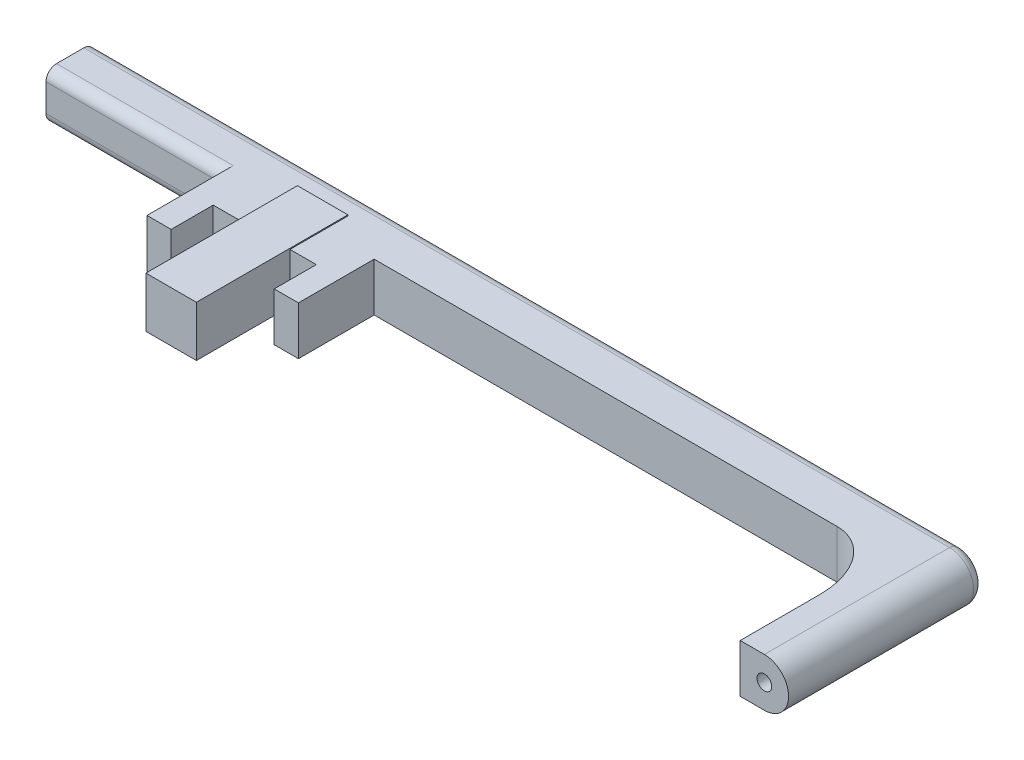
ISO-10303-21;
HEADER;
FILE_DESCRIPTION(('STEP AP214'),'2;1');
FILE_NAME('part.step','',(''),(''),'','','');
FILE_SCHEMA(('AUTOMOTIVE_DESIGN { 1 0 10303 214 1 1 1 1 }'));
ENDSEC;
DATA;
#1=APPLICATION_CONTEXT('core data for automotive mechanical design processes');
#2=APPLICATION_PROTOCOL_DEFINITION('international standard','automotive_design',2000,#1);
#3=PRODUCT_CONTEXT('',#1,'mechanical');
#4=PRODUCT('Part','Part','',(#3));
#5=PRODUCT_RELATED_PRODUCT_CATEGORY('part','',(#4));
#6=PRODUCT_DEFINITION_FORMATION('','',#4);
#7=PRODUCT_DEFINITION_CONTEXT('part definition',#1,'design');
#8=PRODUCT_DEFINITION('design','',#6,#7);
#9=PRODUCT_DEFINITION_SHAPE('','',#8);
#10=(LENGTH_UNIT() NAMED_UNIT(*) SI_UNIT(.MILLI.,.METRE.));
#11=(NAMED_UNIT(*) PLANE_ANGLE_UNIT() SI_UNIT($,.RADIAN.));
#12=(NAMED_UNIT(*) SI_UNIT($,.STERADIAN.) SOLID_ANGLE_UNIT());
#13=UNCERTAINTY_MEASURE_WITH_UNIT(LENGTH_MEASURE(1.E-05),#10,'distance_accuracy_value','');
#14=(GEOMETRIC_REPRESENTATION_CONTEXT(3) GLOBAL_UNCERTAINTY_ASSIGNED_CONTEXT((#13)) GLOBAL_UNIT_ASSIGNED_CONTEXT((#10,
#11,#12)) REPRESENTATION_CONTEXT('',''));
#15=CARTESIAN_POINT('',(0.,0.,0.));
#16=DIRECTION('',(0.,0.,1.));
#17=DIRECTION('',(1.,0.,0.));
#18=AXIS2_PLACEMENT_3D('',#15,#16,#17);
#19=CARTESIAN_POINT('',(1.2,-1.2,7.2));
#20=DIRECTION('',(-1.,0.,0.));
#21=DIRECTION('',(0.,0.,1.));
#22=AXIS2_PLACEMENT_3D('',#19,#20,#21);
#23=PLANE('',#22);
#24=DIRECTION('',(0.,-1.,0.));
#25=VECTOR('',#24,1.);
#26=CARTESIAN_POINT('',(1.2,-1.2,2.75));
#27=LINE('',#26,#25);
#28=CARTESIAN_POINT('',(1.2,1.15,2.75));
#29=VERTEX_POINT('',#28);
#30=CARTESIAN_POINT('',(1.2,-1.15,2.75));
#31=VERTEX_POINT('',#30);
#32=EDGE_CURVE('E526',#29,#31,#27,.T.);
#33=ORIENTED_EDGE('',*,*,#32,.F.);
#34=DIRECTION('',(0.,0.,-1.));
#35=VECTOR('',#34,1.);
#36=CARTESIAN_POINT('',(1.2,1.15,7.2));
#37=LINE('',#36,#35);
#38=CARTESIAN_POINT('',(1.2,1.15,0.));
#39=VERTEX_POINT('',#38);
#40=EDGE_CURVE('E248',#29,#39,#37,.T.);
#41=ORIENTED_EDGE('',*,*,#40,.T.);
#42=DIRECTION('',(0.,1.,0.));
#43=VECTOR('',#42,1.);
#44=CARTESIAN_POINT('',(1.2,-1.2,0.));
#45=LINE('',#44,#43);
#46=CARTESIAN_POINT('',(1.2,1.2,0.));
#47=VERTEX_POINT('',#46);
#48=EDGE_CURVE('E501',#39,#47,#45,.T.);
#49=ORIENTED_EDGE('',*,*,#48,.T.);
#50=DIRECTION('',(0.,0.,-1.));
#51=VECTOR('',#50,1.);
#52=CARTESIAN_POINT('',(1.2,1.2,7.2));
#53=LINE('',#52,#51);
#54=CARTESIAN_POINT('',(1.2,1.2,7.2));
#55=VERTEX_POINT('',#54);
#56=EDGE_CURVE('E476',#55,#47,#53,.T.);
#57=ORIENTED_EDGE('',*,*,#56,.F.);
#58=DIRECTION('',(0.,1.,0.));
#59=VECTOR('',#58,1.);
#60=CARTESIAN_POINT('',(1.2,-1.2,7.2));
#61=LINE('',#60,#59);
#62=CARTESIAN_POINT('',(1.2,-1.2,7.2));
#63=VERTEX_POINT('',#62);
#64=EDGE_CURVE('E492',#63,#55,#61,.T.);
#65=ORIENTED_EDGE('',*,*,#64,.F.);
#66=DIRECTION('',(0.,0.,-1.));
#67=VECTOR('',#66,1.);
#68=CARTESIAN_POINT('',(1.2,-1.2,7.2));
#69=LINE('',#68,#67);
#70=CARTESIAN_POINT('',(1.2,-1.2,0.));
#71=VERTEX_POINT('',#70);
#72=EDGE_CURVE('E486',#63,#71,#69,.T.);
#73=ORIENTED_EDGE('',*,*,#72,.T.);
#74=CARTESIAN_POINT('',(1.2,-1.15,0.));
#75=VERTEX_POINT('',#74);
#76=EDGE_CURVE('E498',#71,#75,#45,.T.);
#77=ORIENTED_EDGE('',*,*,#76,.T.);
#78=DIRECTION('',(0.,0.,1.));
#79=VECTOR('',#78,1.);
#80=CARTESIAN_POINT('',(1.2,-1.15,7.2));
#81=LINE('',#80,#79);
#82=EDGE_CURVE('E509',#75,#31,#81,.T.);
#83=ORIENTED_EDGE('',*,*,#82,.T.);
#84=EDGE_LOOP('',(#33,#41,#49,#57,#65,#73,#77,#83));
#85=FACE_BOUND('',#84,.T.);
#86=ADVANCED_FACE('F42',(#85),#23,.F.);
#87=CARTESIAN_POINT('',(-1.2,-1.2,7.2));
#88=DIRECTION('',(1.,0.,0.));
#89=DIRECTION('',(0.,0.,-1.));
#90=AXIS2_PLACEMENT_3D('',#87,#88,#89);
#91=PLANE('',#90);
#92=DIRECTION('',(0.,0.,1.));
#93=VECTOR('',#92,1.);
#94=CARTESIAN_POINT('',(-1.2,1.15,7.2));
#95=LINE('',#94,#93);
#96=CARTESIAN_POINT('',(-1.2,1.15,0.));
#97=VERTEX_POINT('',#96);
#98=CARTESIAN_POINT('',(-1.2,1.15,2.75));
#99=VERTEX_POINT('',#98);
#100=EDGE_CURVE('E60',#97,#99,#95,.T.);
#101=ORIENTED_EDGE('',*,*,#100,.T.);
#102=DIRECTION('',(0.,1.,0.));
#103=VECTOR('',#102,1.);
#104=CARTESIAN_POINT('',(-1.2,-1.2,2.75));
#105=LINE('',#104,#103);
#106=CARTESIAN_POINT('',(-1.2,-1.15,2.75));
#107=VERTEX_POINT('',#106);
#108=EDGE_CURVE('E528',#107,#99,#105,.T.);
#109=ORIENTED_EDGE('',*,*,#108,.F.);
#110=DIRECTION('',(0.,0.,-1.));
#111=VECTOR('',#110,1.);
#112=CARTESIAN_POINT('',(-1.2,-1.15,7.2));
#113=LINE('',#112,#111);
#114=CARTESIAN_POINT('',(-1.2,-1.15,0.));
#115=VERTEX_POINT('',#114);
#116=EDGE_CURVE('E68',#107,#115,#113,.T.);
#117=ORIENTED_EDGE('',*,*,#116,.T.);
#118=DIRECTION('',(0.,-1.,0.));
#119=VECTOR('',#118,1.);
#120=CARTESIAN_POINT('',(-1.2,-1.2,0.));
#121=LINE('',#120,#119);
#122=CARTESIAN_POINT('',(-1.2,-1.2,0.));
#123=VERTEX_POINT('',#122);
#124=EDGE_CURVE('E495',#115,#123,#121,.T.);
#125=ORIENTED_EDGE('',*,*,#124,.T.);
#126=DIRECTION('',(0.,0.,-1.));
#127=VECTOR('',#126,1.);
#128=CARTESIAN_POINT('',(-1.2,-1.2,7.2));
#129=LINE('',#128,#127);
#130=CARTESIAN_POINT('',(-1.2,-1.2,7.2));
#131=VERTEX_POINT('',#130);
#132=EDGE_CURVE('E483',#131,#123,#129,.T.);
#133=ORIENTED_EDGE('',*,*,#132,.F.);
#134=DIRECTION('',(0.,-1.,0.));
#135=VECTOR('',#134,1.);
#136=CARTESIAN_POINT('',(-1.2,-1.2,7.2));
#137=LINE('',#136,#135);
#138=CARTESIAN_POINT('',(-1.2,1.2,7.2));
#139=VERTEX_POINT('',#138);
#140=EDGE_CURVE('E503',#139,#131,#137,.T.);
#141=ORIENTED_EDGE('',*,*,#140,.F.);
#142=DIRECTION('',(0.,0.,-1.));
#143=VECTOR('',#142,1.);
#144=CARTESIAN_POINT('',(-1.2,1.2,7.2));
#145=LINE('',#144,#143);
#146=CARTESIAN_POINT('',(-1.2,1.2,0.));
#147=VERTEX_POINT('',#146);
#148=EDGE_CURVE('E478',#139,#147,#145,.T.);
#149=ORIENTED_EDGE('',*,*,#148,.T.);
#150=EDGE_CURVE('E493',#147,#97,#121,.T.);
#151=ORIENTED_EDGE('',*,*,#150,.T.);
#152=EDGE_LOOP('',(#101,#109,#117,#125,#133,#141,#149,#151));
#153=FACE_BOUND('',#152,.T.);
#154=ADVANCED_FACE('F604',(#153),#91,.F.);
#155=CARTESIAN_POINT('',(-2.45,0.,-0.65));
#156=DIRECTION('',(-1.,0.,0.));
#157=DIRECTION('',(0.,-1.,0.));
#158=AXIS2_PLACEMENT_3D('',#155,#156,#157);
#159=PLANE('',#158);
#160=DIRECTION('',(0.,-1.,0.));
#161=VECTOR('',#160,1.);
#162=CARTESIAN_POINT('',(-2.45,0.,2.75));
#163=LINE('',#162,#161);
#164=CARTESIAN_POINT('',(-2.45,1.15,2.75));
#165=VERTEX_POINT('',#164);
#166=CARTESIAN_POINT('',(-2.45,-1.15,2.75));
#167=VERTEX_POINT('',#166);
#168=EDGE_CURVE('E237',#165,#167,#163,.T.);
#169=ORIENTED_EDGE('',*,*,#168,.F.);
#170=DIRECTION('',(0.,0.,1.));
#171=VECTOR('',#170,1.);
#172=CARTESIAN_POINT('',(-2.45,1.15,-0.65));
#173=LINE('',#172,#171);
#174=CARTESIAN_POINT('',(-2.45,1.15,4.75));
#175=VERTEX_POINT('',#174);
#176=EDGE_CURVE('E283',#165,#175,#173,.T.);
#177=ORIENTED_EDGE('',*,*,#176,.T.);
#178=DIRECTION('',(0.,-1.,0.));
#179=VECTOR('',#178,1.);
#180=CARTESIAN_POINT('',(-2.45,0.,4.75));
#181=LINE('',#180,#179);
#182=CARTESIAN_POINT('',(-2.45,-1.15,4.75));
#183=VERTEX_POINT('',#182);
#184=EDGE_CURVE('E279',#175,#183,#181,.T.);
#185=ORIENTED_EDGE('',*,*,#184,.T.);
#186=DIRECTION('',(0.,0.,1.));
#187=VECTOR('',#186,1.);
#188=CARTESIAN_POINT('',(-2.45,-1.15,-0.65));
#189=LINE('',#188,#187);
#190=EDGE_CURVE('E286',#167,#183,#189,.T.);
#191=ORIENTED_EDGE('',*,*,#190,.F.);
#192=EDGE_LOOP('',(#169,#177,#185,#191));
#193=FACE_BOUND('',#192,.T.);
#194=ADVANCED_FACE('F540',(#193),#159,.F.);
#195=CARTESIAN_POINT('',(2.45,0.,4.75));
#196=DIRECTION('',(-1.,0.,0.));
#197=DIRECTION('',(0.,0.,1.));
#198=AXIS2_PLACEMENT_3D('',#195,#196,#197);
#199=PLANE('',#198);
#200=DIRECTION('',(0.,0.,-1.));
#201=VECTOR('',#200,1.);
#202=CARTESIAN_POINT('',(2.45,1.15,4.75));
#203=LINE('',#202,#201);
#204=CARTESIAN_POINT('',(2.45,1.15,4.75));
#205=VERTEX_POINT('',#204);
#206=CARTESIAN_POINT('',(2.45,1.15,2.75));
#207=VERTEX_POINT('',#206);
#208=EDGE_CURVE('E244',#205,#207,#203,.T.);
#209=ORIENTED_EDGE('',*,*,#208,.T.);
#210=DIRECTION('',(0.,-1.,0.));
#211=VECTOR('',#210,1.);
#212=CARTESIAN_POINT('',(2.45,0.,2.75));
#213=LINE('',#212,#211);
#214=CARTESIAN_POINT('',(2.45,-1.15,2.75));
#215=VERTEX_POINT('',#214);
#216=EDGE_CURVE('E226',#207,#215,#213,.T.);
#217=ORIENTED_EDGE('',*,*,#216,.T.);
#218=DIRECTION('',(0.,0.,-1.));
#219=VECTOR('',#218,1.);
#220=CARTESIAN_POINT('',(2.45,-1.15,4.75));
#221=LINE('',#220,#219);
#222=CARTESIAN_POINT('',(2.45,-1.15,4.75));
#223=VERTEX_POINT('',#222);
#224=EDGE_CURVE('E265',#223,#215,#221,.T.);
#225=ORIENTED_EDGE('',*,*,#224,.F.);
#226=DIRECTION('',(0.,1.,0.));
#227=VECTOR('',#226,1.);
#228=CARTESIAN_POINT('',(2.45,0.,4.75));
#229=LINE('',#228,#227);
#230=EDGE_CURVE('E253',#223,#205,#229,.T.);
#231=ORIENTED_EDGE('',*,*,#230,.T.);
#232=EDGE_LOOP('',(#209,#217,#225,#231));
#233=FACE_BOUND('',#232,.T.);
#234=ADVANCED_FACE('F251',(#233),#199,.T.);
#235=CARTESIAN_POINT('',(0.,0.,0.));
#236=DIRECTION('',(0.,0.,-1.));
#237=DIRECTION('',(-1.,0.,0.));
#238=AXIS2_PLACEMENT_3D('',#235,#236,#237);
#239=PLANE('',#238);
#240=DIRECTION('',(-1.,0.,0.));
#241=VECTOR('',#240,1.);
#242=CARTESIAN_POINT('',(0.,-1.15,0.));
#243=LINE('',#242,#241);
#244=EDGE_CURVE('E329',#75,#115,#243,.T.);
#245=ORIENTED_EDGE('',*,*,#244,.F.);
#246=ORIENTED_EDGE('',*,*,#76,.F.);
#247=DIRECTION('',(1.,0.,0.));
#248=VECTOR('',#247,1.);
#249=CARTESIAN_POINT('',(-1.2,-1.2,0.));
#250=LINE('',#249,#248);
#251=EDGE_CURVE('E490',#123,#71,#250,.T.);
#252=ORIENTED_EDGE('',*,*,#251,.F.);
#253=ORIENTED_EDGE('',*,*,#124,.F.);
#254=EDGE_LOOP('',(#245,#246,#252,#253));
#255=FACE_BOUND('',#254,.T.);
#256=ADVANCED_FACE('F614',(#255),#239,.T.);
#257=CARTESIAN_POINT('',(-1.2,1.2,7.2));
#258=DIRECTION('',(0.,-1.,0.));
#259=DIRECTION('',(0.,0.,-1.));
#260=AXIS2_PLACEMENT_3D('',#257,#258,#259);
#261=PLANE('',#260);
#262=DIRECTION('',(-1.,0.,0.));
#263=VECTOR('',#262,1.);
#264=CARTESIAN_POINT('',(-1.2,1.2,0.));
#265=LINE('',#264,#263);
#266=EDGE_CURVE('E496',#47,#147,#265,.T.);
#267=ORIENTED_EDGE('',*,*,#266,.T.);
#268=ORIENTED_EDGE('',*,*,#148,.F.);
#269=DIRECTION('',(-1.,0.,0.));
#270=VECTOR('',#269,1.);
#271=CARTESIAN_POINT('',(-1.2,1.2,7.2));
#272=LINE('',#271,#270);
#273=EDGE_CURVE('E505',#55,#139,#272,.T.);
#274=ORIENTED_EDGE('',*,*,#273,.F.);
#275=ORIENTED_EDGE('',*,*,#56,.T.);
#276=EDGE_LOOP('',(#267,#268,#274,#275));
#277=FACE_BOUND('',#276,.T.);
#278=ADVANCED_FACE('F630',(#277),#261,.F.);
#279=CARTESIAN_POINT('',(-1.2,-1.2,7.2));
#280=DIRECTION('',(0.,1.,0.));
#281=DIRECTION('',(0.,0.,1.));
#282=AXIS2_PLACEMENT_3D('',#279,#280,#281);
#283=PLANE('',#282);
#284=ORIENTED_EDGE('',*,*,#251,.T.);
#285=ORIENTED_EDGE('',*,*,#72,.F.);
#286=DIRECTION('',(1.,0.,0.));
#287=VECTOR('',#286,1.);
#288=CARTESIAN_POINT('',(-1.2,-1.2,7.2));
#289=LINE('',#288,#287);
#290=EDGE_CURVE('E489',#131,#63,#289,.T.);
#291=ORIENTED_EDGE('',*,*,#290,.F.);
#292=ORIENTED_EDGE('',*,*,#132,.T.);
#293=EDGE_LOOP('',(#284,#285,#291,#292));
#294=FACE_BOUND('',#293,.T.);
#295=ADVANCED_FACE('F620',(#294),#283,.F.);
#296=CARTESIAN_POINT('',(0.,0.,7.2));
#297=DIRECTION('',(0.,0.,-1.));
#298=DIRECTION('',(-1.,0.,0.));
#299=AXIS2_PLACEMENT_3D('',#296,#297,#298);
#300=PLANE('',#299);
#301=ORIENTED_EDGE('',*,*,#64,.T.);
#302=ORIENTED_EDGE('',*,*,#273,.T.);
#303=ORIENTED_EDGE('',*,*,#140,.T.);
#304=ORIENTED_EDGE('',*,*,#290,.T.);
#305=EDGE_LOOP('',(#301,#302,#303,#304));
#306=FACE_BOUND('',#305,.T.);
#307=ADVANCED_FACE('F622',(#306),#300,.F.);
#308=DIRECTION('',(1.,0.,0.));
#309=VECTOR('',#308,1.);
#310=CARTESIAN_POINT('',(0.,1.15,0.));
#311=LINE('',#310,#309);
#312=EDGE_CURVE('E474',#97,#39,#311,.T.);
#313=ORIENTED_EDGE('',*,*,#312,.F.);
#314=ORIENTED_EDGE('',*,*,#150,.F.);
#315=ORIENTED_EDGE('',*,*,#266,.F.);
#316=ORIENTED_EDGE('',*,*,#48,.F.);
#317=EDGE_LOOP('',(#313,#314,#315,#316));
#318=FACE_BOUND('',#317,.T.);
#319=ADVANCED_FACE('F629',(#318),#239,.T.);
#320=CARTESIAN_POINT('',(-12.,-1.15,1.15));
#321=DIRECTION('',(0.,0.,1.));
#322=DIRECTION('',(1.,0.,0.));
#323=AXIS2_PLACEMENT_3D('',#320,#321,#322);
#324=PLANE('',#323);
#325=DIRECTION('',(0.,1.,0.));
#326=VECTOR('',#325,1.);
#327=CARTESIAN_POINT('',(3.6,-1.15,1.15));
#328=LINE('',#327,#326);
#329=CARTESIAN_POINT('',(3.6,-1.15,1.15));
#330=VERTEX_POINT('',#329);
#331=CARTESIAN_POINT('',(3.6,1.15,1.15));
#332=VERTEX_POINT('',#331);
#333=EDGE_CURVE('E267',#330,#332,#328,.T.);
#334=ORIENTED_EDGE('',*,*,#333,.F.);
#335=DIRECTION('',(1.,0.,0.));
#336=VECTOR('',#335,1.);
#337=CARTESIAN_POINT('',(-12.,-1.15,1.15));
#338=LINE('',#337,#336);
#339=CARTESIAN_POINT('',(25.6,-1.15,1.15));
#340=VERTEX_POINT('',#339);
#341=EDGE_CURVE('E46',#330,#340,#338,.T.);
#342=ORIENTED_EDGE('',*,*,#341,.T.);
#343=CARTESIAN_POINT('',(25.6,1.265,1.15));
#344=CARTESIAN_POINT('',(25.6,0.421666666666668,1.15));
#345=CARTESIAN_POINT('',(25.6,-0.421666666666668,1.15));
#346=CARTESIAN_POINT('',(25.6,-1.265,1.15));
#347=(BOUNDED_CURVE() B_SPLINE_CURVE(3,(#343,#344,#345,#346),.UNSPECIFIED.,.F.,
.F.) B_SPLINE_CURVE_WITH_KNOTS((4,4),(-0.001265,0.001265),
.UNSPECIFIED.) CURVE() GEOMETRIC_REPRESENTATION_ITEM() RATIONAL_B_SPLINE_CURVE((1.,1.,1.,1.)) REPRESENTATION_ITEM(''));
#348=CARTESIAN_POINT('',(25.6,1.15,1.15));
#349=VERTEX_POINT('',#348);
#350=EDGE_CURVE('E461',#340,#349,#347,.F.);
#351=ORIENTED_EDGE('',*,*,#350,.T.);
#352=DIRECTION('',(1.,0.,0.));
#353=VECTOR('',#352,1.);
#354=CARTESIAN_POINT('',(-12.,1.15,1.15));
#355=LINE('',#354,#353);
#356=EDGE_CURVE('E351',#332,#349,#355,.T.);
#357=ORIENTED_EDGE('',*,*,#356,.F.);
#358=EDGE_LOOP('',(#334,#342,#351,#357));
#359=FACE_BOUND('',#358,.T.);
#360=ADVANCED_FACE('F513',(#359),#324,.T.);
#361=DIRECTION('',(0.,-1.,0.));
#362=VECTOR('',#361,1.);
#363=CARTESIAN_POINT('',(-3.6,-1.15,1.15));
#364=LINE('',#363,#362);
#365=CARTESIAN_POINT('',(-3.6,0.65,1.15));
#366=VERTEX_POINT('',#365);
#367=CARTESIAN_POINT('',(-3.6,-0.65,1.15));
#368=VERTEX_POINT('',#367);
#369=EDGE_CURVE('E285',#366,#368,#364,.T.);
#370=ORIENTED_EDGE('',*,*,#369,.F.);
#371=DIRECTION('',(1.,0.,0.));
#372=VECTOR('',#371,1.);
#373=CARTESIAN_POINT('',(-12.,0.65,1.15));
#374=LINE('',#373,#372);
#375=CARTESIAN_POINT('',(-12.,0.65,1.15));
#376=VERTEX_POINT('',#375);
#377=EDGE_CURVE('E369',#366,#376,#374,.F.);
#378=ORIENTED_EDGE('',*,*,#377,.T.);
#379=DIRECTION('',(0.,-1.,0.));
#380=VECTOR('',#379,1.);
#381=CARTESIAN_POINT('',(-12.,-1.15,1.15));
#382=LINE('',#381,#380);
#383=CARTESIAN_POINT('',(-12.,-0.65,1.15));
#384=VERTEX_POINT('',#383);
#385=EDGE_CURVE('E346',#376,#384,#382,.T.);
#386=ORIENTED_EDGE('',*,*,#385,.T.);
#387=DIRECTION('',(1.,0.,0.));
#388=VECTOR('',#387,1.);
#389=CARTESIAN_POINT('',(-12.,-0.65,1.15));
#390=LINE('',#389,#388);
#391=EDGE_CURVE('E366',#384,#368,#390,.T.);
#392=ORIENTED_EDGE('',*,*,#391,.T.);
#393=EDGE_LOOP('',(#370,#378,#386,#392));
#394=FACE_BOUND('',#393,.T.);
#395=ADVANCED_FACE('F562',(#394),#324,.T.);
#396=CARTESIAN_POINT('',(-12.,-1.15,1.15));
#397=DIRECTION('',(0.,-1.,0.));
#398=DIRECTION('',(0.,0.,-1.));
#399=AXIS2_PLACEMENT_3D('',#396,#397,#398);
#400=PLANE('',#399);
#401=DIRECTION('',(1.,0.,0.));
#402=VECTOR('',#401,1.);
#403=CARTESIAN_POINT('',(-12.,-1.15,-0.65));
#404=LINE('',#403,#402);
#405=CARTESIAN_POINT('',(-12.,-1.15,-0.65));
#406=VERTEX_POINT('',#405);
#407=CARTESIAN_POINT('',(29.15,-1.15,-0.65));
#408=VERTEX_POINT('',#407);
#409=EDGE_CURVE('E387',#406,#408,#404,.T.);
#410=ORIENTED_EDGE('',*,*,#409,.T.);
#411=DIRECTION('',(0.,0.,-1.));
#412=VECTOR('',#411,1.);
#413=CARTESIAN_POINT('',(29.15,-1.15,8.15));
#414=LINE('',#413,#412);
#415=CARTESIAN_POINT('',(29.15,-1.15,8.15));
#416=VERTEX_POINT('',#415);
#417=EDGE_CURVE('E336',#416,#408,#414,.T.);
#418=ORIENTED_EDGE('',*,*,#417,.F.);
#419=DIRECTION('',(1.,0.,0.));
#420=VECTOR('',#419,1.);
#421=CARTESIAN_POINT('',(28.,-1.15,8.15));
#422=LINE('',#421,#420);
#423=CARTESIAN_POINT('',(28.,-1.15,8.15));
#424=VERTEX_POINT('',#423);
#425=EDGE_CURVE('E313',#424,#416,#422,.T.);
#426=ORIENTED_EDGE('',*,*,#425,.F.);
#427=DIRECTION('',(0.,0.,-1.));
#428=VECTOR('',#427,1.);
#429=CARTESIAN_POINT('',(28.,-1.15,8.15));
#430=LINE('',#429,#428);
#431=CARTESIAN_POINT('',(28.,-1.15,4.35));
#432=VERTEX_POINT('',#431);
#433=EDGE_CURVE('E331',#424,#432,#430,.T.);
#434=ORIENTED_EDGE('',*,*,#433,.T.);
#435=CARTESIAN_POINT('',(25.6,-1.15,1.15));
#436=CARTESIAN_POINT('',(28.,-1.15,1.15));
#437=CARTESIAN_POINT('',(28.,-1.15,4.35));
#438=(BOUNDED_CURVE() B_SPLINE_CURVE(2,(#435,#436,#437),.UNSPECIFIED.,.F.,
.F.) B_SPLINE_CURVE_WITH_KNOTS((3,3),(0.,1.),
.UNSPECIFIED.) CURVE() GEOMETRIC_REPRESENTATION_ITEM() RATIONAL_B_SPLINE_CURVE((1.,
0.707106781186548,1.)) REPRESENTATION_ITEM(''));
#439=EDGE_CURVE('E465',#432,#340,#438,.F.);
#440=ORIENTED_EDGE('',*,*,#439,.T.);
#441=ORIENTED_EDGE('',*,*,#341,.F.);
#442=DIRECTION('',(0.,0.,-1.));
#443=VECTOR('',#442,1.);
#444=CARTESIAN_POINT('',(3.6,-1.15,4.75));
#445=LINE('',#444,#443);
#446=CARTESIAN_POINT('',(3.6,-1.15,4.75));
#447=VERTEX_POINT('',#446);
#448=EDGE_CURVE('E258',#447,#330,#445,.T.);
#449=ORIENTED_EDGE('',*,*,#448,.F.);
#450=DIRECTION('',(1.,0.,0.));
#451=VECTOR('',#450,1.);
#452=CARTESIAN_POINT('',(0.,-1.15,4.75));
#453=LINE('',#452,#451);
#454=EDGE_CURVE('E518',#223,#447,#453,.T.);
#455=ORIENTED_EDGE('',*,*,#454,.F.);
#456=ORIENTED_EDGE('',*,*,#224,.T.);
#457=DIRECTION('',(1.,0.,0.));
#458=VECTOR('',#457,1.);
#459=CARTESIAN_POINT('',(-3.6,-1.15,2.75));
#460=LINE('',#459,#458);
#461=EDGE_CURVE('E233',#31,#215,#460,.T.);
#462=ORIENTED_EDGE('',*,*,#461,.F.);
#463=ORIENTED_EDGE('',*,*,#82,.F.);
#464=ORIENTED_EDGE('',*,*,#244,.T.);
#465=ORIENTED_EDGE('',*,*,#116,.F.);
#466=EDGE_CURVE('E238',#167,#107,#460,.T.);
#467=ORIENTED_EDGE('',*,*,#466,.F.);
#468=ORIENTED_EDGE('',*,*,#190,.T.);
#469=DIRECTION('',(1.,0.,0.));
#470=VECTOR('',#469,1.);
#471=CARTESIAN_POINT('',(0.,-1.15,4.75));
#472=LINE('',#471,#470);
#473=CARTESIAN_POINT('',(-3.6,-1.15,4.75));
#474=VERTEX_POINT('',#473);
#475=EDGE_CURVE('E276',#474,#183,#472,.T.);
#476=ORIENTED_EDGE('',*,*,#475,.F.);
#477=DIRECTION('',(0.,0.,1.));
#478=VECTOR('',#477,1.);
#479=CARTESIAN_POINT('',(-3.6,-1.15,-0.65));
#480=LINE('',#479,#478);
#481=CARTESIAN_POINT('',(-3.6,-1.15,0.65));
#482=VERTEX_POINT('',#481);
#483=EDGE_CURVE('E288',#482,#474,#480,.T.);
#484=ORIENTED_EDGE('',*,*,#483,.F.);
#485=DIRECTION('',(1.,0.,0.));
#486=VECTOR('',#485,1.);
#487=CARTESIAN_POINT('',(-12.,-1.15,0.65));
#488=LINE('',#487,#486);
#489=CARTESIAN_POINT('',(-12.,-1.15,0.65));
#490=VERTEX_POINT('',#489);
#491=EDGE_CURVE('E389',#482,#490,#488,.F.);
#492=ORIENTED_EDGE('',*,*,#491,.T.);
#493=DIRECTION('',(0.,0.,-1.));
#494=VECTOR('',#493,1.);
#495=CARTESIAN_POINT('',(-12.,-1.15,1.15));
#496=LINE('',#495,#494);
#497=EDGE_CURVE('E349',#490,#406,#496,.T.);
#498=ORIENTED_EDGE('',*,*,#497,.T.);
#499=EDGE_LOOP('',(#410,#418,#426,#434,#440,#441,#449,#455,#456,#462,#463,#464,#465,#467,#468,
#476,#484,#492,#498));
#500=FACE_BOUND('',#499,.T.);
#501=ADVANCED_FACE('F515',(#500),#400,.T.);
#502=CARTESIAN_POINT('',(-12.,1.15,1.15));
#503=DIRECTION('',(0.,1.,0.));
#504=DIRECTION('',(0.,0.,1.));
#505=AXIS2_PLACEMENT_3D('',#502,#503,#504);
#506=PLANE('',#505);
#507=DIRECTION('',(-1.,0.,0.));
#508=VECTOR('',#507,1.);
#509=CARTESIAN_POINT('',(-3.6,1.15,2.75));
#510=LINE('',#509,#508);
#511=EDGE_CURVE('E249',#99,#165,#510,.T.);
#512=ORIENTED_EDGE('',*,*,#511,.F.);
#513=ORIENTED_EDGE('',*,*,#100,.F.);
#514=ORIENTED_EDGE('',*,*,#312,.T.);
#515=ORIENTED_EDGE('',*,*,#40,.F.);
#516=EDGE_CURVE('E230',#207,#29,#510,.T.);
#517=ORIENTED_EDGE('',*,*,#516,.F.);
#518=ORIENTED_EDGE('',*,*,#208,.F.);
#519=DIRECTION('',(1.,0.,0.));
#520=VECTOR('',#519,1.);
#521=CARTESIAN_POINT('',(0.,1.15,4.75));
#522=LINE('',#521,#520);
#523=CARTESIAN_POINT('',(3.6,1.15,4.75));
#524=VERTEX_POINT('',#523);
#525=EDGE_CURVE('E256',#205,#524,#522,.T.);
#526=ORIENTED_EDGE('',*,*,#525,.T.);
#527=DIRECTION('',(0.,0.,-1.));
#528=VECTOR('',#527,1.);
#529=CARTESIAN_POINT('',(3.6,1.15,4.75));
#530=LINE('',#529,#528);
#531=EDGE_CURVE('E255',#524,#332,#530,.T.);
#532=ORIENTED_EDGE('',*,*,#531,.T.);
#533=ORIENTED_EDGE('',*,*,#356,.T.);
#534=CARTESIAN_POINT('',(28.,1.15,4.35));
#535=CARTESIAN_POINT('',(28.,1.15,1.15));
#536=CARTESIAN_POINT('',(25.6,1.15,1.15));
#537=(BOUNDED_CURVE() B_SPLINE_CURVE(2,(#534,#535,#536),.UNSPECIFIED.,.F.,
.F.) B_SPLINE_CURVE_WITH_KNOTS((3,3),(0.,1.),
.UNSPECIFIED.) CURVE() GEOMETRIC_REPRESENTATION_ITEM() RATIONAL_B_SPLINE_CURVE((1.,
0.707106781186548,1.)) REPRESENTATION_ITEM(''));
#538=CARTESIAN_POINT('',(28.,1.15,4.35));
#539=VERTEX_POINT('',#538);
#540=EDGE_CURVE('E391',#349,#539,#537,.F.);
#541=ORIENTED_EDGE('',*,*,#540,.T.);
#542=DIRECTION('',(0.,0.,-1.));
#543=VECTOR('',#542,1.);
#544=CARTESIAN_POINT('',(28.,1.15,8.15));
#545=LINE('',#544,#543);
#546=CARTESIAN_POINT('',(28.,1.15,8.15));
#547=VERTEX_POINT('',#546);
#548=EDGE_CURVE('E320',#547,#539,#545,.T.);
#549=ORIENTED_EDGE('',*,*,#548,.F.);
#550=DIRECTION('',(-1.,0.,0.));
#551=VECTOR('',#550,1.);
#552=CARTESIAN_POINT('',(28.,1.15,8.15));
#553=LINE('',#552,#551);
#554=CARTESIAN_POINT('',(29.15,1.15,8.15));
#555=VERTEX_POINT('',#554);
#556=EDGE_CURVE('E317',#555,#547,#553,.T.);
#557=ORIENTED_EDGE('',*,*,#556,.F.);
#558=DIRECTION('',(0.,0.,-1.));
#559=VECTOR('',#558,1.);
#560=CARTESIAN_POINT('',(29.15,1.15,8.15));
#561=LINE('',#560,#559);
#562=CARTESIAN_POINT('',(29.15,1.15,-0.65));
#563=VERTEX_POINT('',#562);
#564=EDGE_CURVE('E323',#555,#563,#561,.T.);
#565=ORIENTED_EDGE('',*,*,#564,.T.);
#566=DIRECTION('',(1.,0.,0.));
#567=VECTOR('',#566,1.);
#568=CARTESIAN_POINT('',(-12.,1.15,-0.65));
#569=LINE('',#568,#567);
#570=CARTESIAN_POINT('',(-12.,1.15,-0.65));
#571=VERTEX_POINT('',#570);
#572=EDGE_CURVE('E364',#563,#571,#569,.F.);
#573=ORIENTED_EDGE('',*,*,#572,.T.);
#574=DIRECTION('',(0.,0.,1.));
#575=VECTOR('',#574,1.);
#576=CARTESIAN_POINT('',(-12.,1.15,1.15));
#577=LINE('',#576,#575);
#578=CARTESIAN_POINT('',(-12.,1.15,0.65));
#579=VERTEX_POINT('',#578);
#580=EDGE_CURVE('E343',#571,#579,#577,.T.);
#581=ORIENTED_EDGE('',*,*,#580,.T.);
#582=DIRECTION('',(1.,0.,0.));
#583=VECTOR('',#582,1.);
#584=CARTESIAN_POINT('',(-12.,1.15,0.65));
#585=LINE('',#584,#583);
#586=CARTESIAN_POINT('',(-3.6,1.15,0.65));
#587=VERTEX_POINT('',#586);
#588=EDGE_CURVE('E52',#579,#587,#585,.T.);
#589=ORIENTED_EDGE('',*,*,#588,.T.);
#590=DIRECTION('',(0.,0.,1.));
#591=VECTOR('',#590,1.);
#592=CARTESIAN_POINT('',(-3.6,1.15,-0.65));
#593=LINE('',#592,#591);
#594=CARTESIAN_POINT('',(-3.6,1.15,4.75));
#595=VERTEX_POINT('',#594);
#596=EDGE_CURVE('E282',#587,#595,#593,.T.);
#597=ORIENTED_EDGE('',*,*,#596,.T.);
#598=DIRECTION('',(1.,0.,0.));
#599=VECTOR('',#598,1.);
#600=CARTESIAN_POINT('',(0.,1.15,4.75));
#601=LINE('',#600,#599);
#602=EDGE_CURVE('E270',#595,#175,#601,.T.);
#603=ORIENTED_EDGE('',*,*,#602,.T.);
#604=ORIENTED_EDGE('',*,*,#176,.F.);
#605=EDGE_LOOP('',(#512,#513,#514,#515,#517,#518,#526,#532,#533,#541,#549,#557,#565,#573,#581,
#589,#597,#603,#604));
#606=FACE_BOUND('',#605,.T.);
#607=ADVANCED_FACE('F242',(#606),#506,.T.);
#608=CARTESIAN_POINT('',(-12.,-1.15,-1.15));
#609=DIRECTION('',(0.,0.,-1.));
#610=DIRECTION('',(-1.,0.,0.));
#611=AXIS2_PLACEMENT_3D('',#608,#609,#610);
#612=PLANE('',#611);
#613=CARTESIAN_POINT('',(29.15,0.,-1.15));
#614=DIRECTION('',(0.,0.,-1.));
#615=DIRECTION('',(-1.,0.,0.));
#616=AXIS2_PLACEMENT_3D('',#613,#614,#615);
#617=CIRCLE('',#616,0.65);
#618=CARTESIAN_POINT('',(29.15,0.65,-1.15));
#619=VERTEX_POINT('',#618);
#620=CARTESIAN_POINT('',(29.15,-0.65,-1.15));
#621=VERTEX_POINT('',#620);
#622=EDGE_CURVE('E383',#619,#621,#617,.T.);
#623=ORIENTED_EDGE('',*,*,#622,.T.);
#624=DIRECTION('',(1.,0.,0.));
#625=VECTOR('',#624,1.);
#626=CARTESIAN_POINT('',(-12.,-0.65,-1.15));
#627=LINE('',#626,#625);
#628=CARTESIAN_POINT('',(-12.,-0.65,-1.15));
#629=VERTEX_POINT('',#628);
#630=EDGE_CURVE('E381',#621,#629,#627,.F.);
#631=ORIENTED_EDGE('',*,*,#630,.T.);
#632=DIRECTION('',(0.,1.,0.));
#633=VECTOR('',#632,1.);
#634=CARTESIAN_POINT('',(-12.,-1.15,-1.15));
#635=LINE('',#634,#633);
#636=CARTESIAN_POINT('',(-12.,0.65,-1.15));
#637=VERTEX_POINT('',#636);
#638=EDGE_CURVE('E335',#629,#637,#635,.T.);
#639=ORIENTED_EDGE('',*,*,#638,.T.);
#640=DIRECTION('',(1.,0.,0.));
#641=VECTOR('',#640,1.);
#642=CARTESIAN_POINT('',(-12.,0.65,-1.15));
#643=LINE('',#642,#641);
#644=EDGE_CURVE('E385',#637,#619,#643,.T.);
#645=ORIENTED_EDGE('',*,*,#644,.T.);
#646=EDGE_LOOP('',(#623,#631,#639,#645));
#647=FACE_BOUND('',#646,.T.);
#648=CARTESIAN_POINT('',(29.15,0.,-1.15));
#649=DIRECTION('',(0.,0.,-1.));
#650=DIRECTION('',(-1.,0.,0.));
#651=AXIS2_PLACEMENT_3D('',#648,#649,#650);
#652=CIRCLE('',#651,0.350000000000001);
#653=CARTESIAN_POINT('',(28.8,0.,-1.15));
#654=VERTEX_POINT('',#653);
#655=EDGE_CURVE('E303',#654,#654,#652,.F.);
#656=ORIENTED_EDGE('',*,*,#655,.T.);
#657=EDGE_LOOP('',(#656));
#658=FACE_BOUND('',#657,.T.);
#659=ADVANCED_FACE('F575',(#647,#658),#612,.T.);
#660=CARTESIAN_POINT('',(-12.,0.,0.));
#661=DIRECTION('',(-1.,0.,0.));
#662=DIRECTION('',(0.,0.,1.));
#663=AXIS2_PLACEMENT_3D('',#660,#661,#662);
#664=PLANE('',#663);
#665=CARTESIAN_POINT('',(-12.,0.,0.));
#666=DIRECTION('',(-1.,0.,0.));
#667=DIRECTION('',(0.,0.,1.));
#668=AXIS2_PLACEMENT_3D('',#665,#666,#667);
#669=CIRCLE('',#668,0.35);
#670=CARTESIAN_POINT('',(-12.,0.,0.35));
#671=VERTEX_POINT('',#670);
#672=EDGE_CURVE('E300',#671,#671,#669,.T.);
#673=ORIENTED_EDGE('',*,*,#672,.F.);
#674=EDGE_LOOP('',(#673));
#675=FACE_BOUND('',#674,.T.);
#676=ORIENTED_EDGE('',*,*,#638,.F.);
#677=CARTESIAN_POINT('',(-12.,-0.65,-0.65));
#678=DIRECTION('',(-1.,0.,0.));
#679=DIRECTION('',(0.,0.,1.));
#680=AXIS2_PLACEMENT_3D('',#677,#678,#679);
#681=CIRCLE('',#680,0.5);
#682=EDGE_CURVE('E373',#629,#406,#681,.T.);
#683=ORIENTED_EDGE('',*,*,#682,.T.);
#684=ORIENTED_EDGE('',*,*,#497,.F.);
#685=CARTESIAN_POINT('',(-12.,-0.65,0.65));
#686=DIRECTION('',(-1.,0.,0.));
#687=DIRECTION('',(0.,0.,1.));
#688=AXIS2_PLACEMENT_3D('',#685,#686,#687);
#689=CIRCLE('',#688,0.5);
#690=EDGE_CURVE('E375',#490,#384,#689,.T.);
#691=ORIENTED_EDGE('',*,*,#690,.T.);
#692=ORIENTED_EDGE('',*,*,#385,.F.);
#693=CARTESIAN_POINT('',(-12.,0.65,0.65));
#694=DIRECTION('',(-1.,0.,0.));
#695=DIRECTION('',(0.,0.,1.));
#696=AXIS2_PLACEMENT_3D('',#693,#694,#695);
#697=CIRCLE('',#696,0.5);
#698=EDGE_CURVE('E377',#376,#579,#697,.T.);
#699=ORIENTED_EDGE('',*,*,#698,.T.);
#700=ORIENTED_EDGE('',*,*,#580,.F.);
#701=CARTESIAN_POINT('',(-12.,0.65,-0.65));
#702=DIRECTION('',(-1.,0.,0.));
#703=DIRECTION('',(0.,0.,1.));
#704=AXIS2_PLACEMENT_3D('',#701,#702,#703);
#705=CIRCLE('',#704,0.5);
#706=EDGE_CURVE('E379',#571,#637,#705,.T.);
#707=ORIENTED_EDGE('',*,*,#706,.T.);
#708=EDGE_LOOP('',(#676,#683,#684,#691,#692,#699,#700,#707));
#709=FACE_BOUND('',#708,.T.);
#710=ADVANCED_FACE('F555',(#675,#709),#664,.T.);
#711=CARTESIAN_POINT('',(28.,0.,8.15));
#712=DIRECTION('',(1.,0.,0.));
#713=DIRECTION('',(0.,0.,-1.));
#714=AXIS2_PLACEMENT_3D('',#711,#712,#713);
#715=PLANE('',#714);
#716=ORIENTED_EDGE('',*,*,#548,.T.);
#717=CARTESIAN_POINT('',(28.,-1.265,4.35));
#718=CARTESIAN_POINT('',(28.,-0.421666666666668,4.35));
#719=CARTESIAN_POINT('',(28.,0.421666666666668,4.35));
#720=CARTESIAN_POINT('',(28.,1.265,4.35));
#721=(BOUNDED_CURVE() B_SPLINE_CURVE(3,(#717,#718,#719,#720),.UNSPECIFIED.,.F.,
.F.) B_SPLINE_CURVE_WITH_KNOTS((4,4),(-0.001265,0.001265),
.UNSPECIFIED.) CURVE() GEOMETRIC_REPRESENTATION_ITEM() RATIONAL_B_SPLINE_CURVE((1.,1.,1.,1.)) REPRESENTATION_ITEM(''));
#722=EDGE_CURVE('E462',#539,#432,#721,.F.);
#723=ORIENTED_EDGE('',*,*,#722,.T.);
#724=ORIENTED_EDGE('',*,*,#433,.F.);
#725=DIRECTION('',(0.,-1.,0.));
#726=VECTOR('',#725,1.);
#727=CARTESIAN_POINT('',(28.,0.,8.15));
#728=LINE('',#727,#726);
#729=EDGE_CURVE('E310',#547,#424,#728,.T.);
#730=ORIENTED_EDGE('',*,*,#729,.F.);
#731=EDGE_LOOP('',(#716,#723,#724,#730));
#732=FACE_BOUND('',#731,.T.);
#733=ADVANCED_FACE('F591',(#732),#715,.F.);
#734=CARTESIAN_POINT('',(29.15,0.,8.15));
#735=DIRECTION('',(0.,0.,1.));
#736=DIRECTION('',(1.,0.,0.));
#737=AXIS2_PLACEMENT_3D('',#734,#735,#736);
#738=PLANE('',#737);
#739=ORIENTED_EDGE('',*,*,#729,.T.);
#740=ORIENTED_EDGE('',*,*,#425,.T.);
#741=CARTESIAN_POINT('',(29.15,0.,8.15));
#742=DIRECTION('',(0.,0.,1.));
#743=DIRECTION('',(1.,0.,0.));
#744=AXIS2_PLACEMENT_3D('',#741,#742,#743);
#745=CIRCLE('',#744,1.15);
#746=EDGE_CURVE('E315',#416,#555,#745,.T.);
#747=ORIENTED_EDGE('',*,*,#746,.T.);
#748=ORIENTED_EDGE('',*,*,#556,.T.);
#749=EDGE_LOOP('',(#739,#740,#747,#748));
#750=FACE_BOUND('',#749,.T.);
#751=CARTESIAN_POINT('',(29.15,0.,8.15));
#752=DIRECTION('',(0.,0.,1.));
#753=DIRECTION('',(1.,0.,0.));
#754=AXIS2_PLACEMENT_3D('',#751,#752,#753);
#755=CIRCLE('',#754,0.350000000000001);
#756=CARTESIAN_POINT('',(29.5,0.,8.15));
#757=VERTEX_POINT('',#756);
#758=EDGE_CURVE('E307',#757,#757,#755,.T.);
#759=ORIENTED_EDGE('',*,*,#758,.F.);
#760=EDGE_LOOP('',(#759));
#761=FACE_BOUND('',#760,.T.);
#762=ADVANCED_FACE('F589',(#750,#761),#738,.T.);
#763=CARTESIAN_POINT('',(29.15,0.,8.15));
#764=DIRECTION('',(0.,0.,-1.));
#765=DIRECTION('',(-1.,0.,0.));
#766=AXIS2_PLACEMENT_3D('',#763,#764,#765);
#767=CYLINDRICAL_SURFACE('',#766,1.15);
#768=ORIENTED_EDGE('',*,*,#417,.T.);
#769=CARTESIAN_POINT('',(29.15,0.,-0.65));
#770=DIRECTION('',(0.,0.,-1.));
#771=DIRECTION('',(-1.,0.,0.));
#772=AXIS2_PLACEMENT_3D('',#769,#770,#771);
#773=CIRCLE('',#772,1.15);
#774=EDGE_CURVE('E371',#408,#563,#773,.F.);
#775=ORIENTED_EDGE('',*,*,#774,.T.);
#776=ORIENTED_EDGE('',*,*,#564,.F.);
#777=ORIENTED_EDGE('',*,*,#746,.F.);
#778=EDGE_LOOP('',(#768,#775,#776,#777));
#779=FACE_BOUND('',#778,.T.);
#780=ADVANCED_FACE('F586',(#779),#767,.T.);
#781=CARTESIAN_POINT('',(29.15,0.,8.15));
#782=DIRECTION('',(0.,0.,-1.));
#783=DIRECTION('',(-1.,0.,0.));
#784=AXIS2_PLACEMENT_3D('',#781,#782,#783);
#785=CYLINDRICAL_SURFACE('',#784,0.350000000000001);
#786=ORIENTED_EDGE('',*,*,#758,.T.);
#787=EDGE_LOOP('',(#786));
#788=FACE_BOUND('',#787,.T.);
#789=ORIENTED_EDGE('',*,*,#655,.F.);
#790=EDGE_LOOP('',(#789));
#791=FACE_BOUND('',#790,.T.);
#792=ADVANCED_FACE('F669',(#788,#791),#785,.F.);
#793=CARTESIAN_POINT('',(-2.,0.,0.));
#794=DIRECTION('',(-1.,0.,0.));
#795=DIRECTION('',(0.,0.,1.));
#796=AXIS2_PLACEMENT_3D('',#793,#794,#795);
#797=CYLINDRICAL_SURFACE('',#796,0.35);
#798=CARTESIAN_POINT('',(-3.6,0.,0.));
#799=DIRECTION('',(-1.,0.,0.));
#800=DIRECTION('',(0.,-1.,0.));
#801=AXIS2_PLACEMENT_3D('',#798,#799,#800);
#802=CIRCLE('',#801,0.35);
#803=CARTESIAN_POINT('',(-3.6,-0.35,0.));
#804=VERTEX_POINT('',#803);
#805=EDGE_CURVE('E296',#804,#804,#802,.F.);
#806=ORIENTED_EDGE('',*,*,#805,.T.);
#807=EDGE_LOOP('',(#806));
#808=FACE_BOUND('',#807,.T.);
#809=ORIENTED_EDGE('',*,*,#672,.T.);
#810=EDGE_LOOP('',(#809));
#811=FACE_BOUND('',#810,.T.);
#812=ADVANCED_FACE('F413',(#808,#811),#797,.F.);
#813=CARTESIAN_POINT('',(28.,1.265,4.35));
#814=CARTESIAN_POINT('',(28.,0.421666666666668,4.35));
#815=CARTESIAN_POINT('',(28.,-0.421666666666668,4.35));
#816=CARTESIAN_POINT('',(28.,-1.265,4.35));
#817=CARTESIAN_POINT('',(28.,1.265,1.15));
#818=CARTESIAN_POINT('',(28.,0.421666666666668,1.15));
#819=CARTESIAN_POINT('',(28.,-0.421666666666668,1.15));
#820=CARTESIAN_POINT('',(28.,-1.265,1.15));
#821=CARTESIAN_POINT('',(25.6,1.265,1.15));
#822=CARTESIAN_POINT('',(25.6,0.421666666666668,1.15));
#823=CARTESIAN_POINT('',(25.6,-0.421666666666668,1.15));
#824=CARTESIAN_POINT('',(25.6,-1.265,1.15));
#825=(BOUNDED_SURFACE() B_SPLINE_SURFACE(2,3,((#813,#814,#815,#816),(#817,#818,#819,#820),(#821,
#822,#823,#824)),.UNSPECIFIED.,.F.,.F.,.F.) B_SPLINE_SURFACE_WITH_KNOTS((3,3),(4,4),(0.,1.),
(-0.001265,0.001265),
.UNSPECIFIED.) GEOMETRIC_REPRESENTATION_ITEM() RATIONAL_B_SPLINE_SURFACE(((1.,1.,1.,1.),
(0.707106781186548,0.707106781186548,0.707106781186548,0.707106781186548),(1.,1.,1.,1.))) REPRESENTATION_ITEM('') SURFACE());
#826=ORIENTED_EDGE('',*,*,#540,.F.);
#827=ORIENTED_EDGE('',*,*,#350,.F.);
#828=ORIENTED_EDGE('',*,*,#439,.F.);
#829=ORIENTED_EDGE('',*,*,#722,.F.);
#830=EDGE_LOOP('',(#826,#827,#828,#829));
#831=FACE_BOUND('',#830,.T.);
#832=ADVANCED_FACE('F398',(#831),#825,.T.);
#833=CARTESIAN_POINT('',(-12.,0.65,-0.65));
#834=DIRECTION('',(1.,0.,0.));
#835=DIRECTION('',(0.,0.,-1.));
#836=AXIS2_PLACEMENT_3D('',#833,#834,#835);
#837=CYLINDRICAL_SURFACE('',#836,0.5);
#838=ORIENTED_EDGE('',*,*,#706,.F.);
#839=ORIENTED_EDGE('',*,*,#572,.F.);
#840=CARTESIAN_POINT('',(29.15,0.65,-0.65));
#841=DIRECTION('',(1.,0.,0.));
#842=DIRECTION('',(0.,0.,-1.));
#843=AXIS2_PLACEMENT_3D('',#840,#841,#842);
#844=CIRCLE('',#843,0.5);
#845=EDGE_CURVE('E304',#619,#563,#844,.T.);
#846=ORIENTED_EDGE('',*,*,#845,.F.);
#847=ORIENTED_EDGE('',*,*,#644,.F.);
#848=EDGE_LOOP('',(#838,#839,#846,#847));
#849=FACE_BOUND('',#848,.T.);
#850=ADVANCED_FACE('F412',(#849),#837,.T.);
#851=CARTESIAN_POINT('',(29.15,0.,-0.65));
#852=DIRECTION('',(0.,0.,-1.));
#853=DIRECTION('',(-1.,0.,0.));
#854=AXIS2_PLACEMENT_3D('',#851,#852,#853);
#855=TOROIDAL_SURFACE('',#854,0.65,0.5);
#856=ORIENTED_EDGE('',*,*,#845,.T.);
#857=ORIENTED_EDGE('',*,*,#774,.F.);
#858=CARTESIAN_POINT('',(29.15,-0.65,-0.65));
#859=DIRECTION('',(-1.,0.,0.));
#860=DIRECTION('',(0.,0.,1.));
#861=AXIS2_PLACEMENT_3D('',#858,#859,#860);
#862=CIRCLE('',#861,0.5);
#863=EDGE_CURVE('E299',#621,#408,#862,.T.);
#864=ORIENTED_EDGE('',*,*,#863,.F.);
#865=ORIENTED_EDGE('',*,*,#622,.F.);
#866=EDGE_LOOP('',(#856,#857,#864,#865));
#867=FACE_BOUND('',#866,.T.);
#868=ADVANCED_FACE('F733',(#867),#855,.T.);
#869=CARTESIAN_POINT('',(-12.,-0.65,-0.65));
#870=DIRECTION('',(1.,0.,0.));
#871=DIRECTION('',(0.,0.,-1.));
#872=AXIS2_PLACEMENT_3D('',#869,#870,#871);
#873=CYLINDRICAL_SURFACE('',#872,0.5);
#874=ORIENTED_EDGE('',*,*,#682,.F.);
#875=ORIENTED_EDGE('',*,*,#630,.F.);
#876=ORIENTED_EDGE('',*,*,#863,.T.);
#877=ORIENTED_EDGE('',*,*,#409,.F.);
#878=EDGE_LOOP('',(#874,#875,#876,#877));
#879=FACE_BOUND('',#878,.T.);
#880=ADVANCED_FACE('F416',(#879),#873,.T.);
#881=CARTESIAN_POINT('',(-12.,-0.65,0.65));
#882=DIRECTION('',(1.,0.,0.));
#883=DIRECTION('',(0.,0.,-1.));
#884=AXIS2_PLACEMENT_3D('',#881,#882,#883);
#885=CYLINDRICAL_SURFACE('',#884,0.5);
#886=CARTESIAN_POINT('',(-3.6,-0.65,0.65));
#887=DIRECTION('',(-1.,0.,0.));
#888=DIRECTION('',(0.,-1.,0.));
#889=AXIS2_PLACEMENT_3D('',#886,#887,#888);
#890=CIRCLE('',#889,0.5);
#891=EDGE_CURVE('E293',#368,#482,#890,.F.);
#892=ORIENTED_EDGE('',*,*,#891,.F.);
#893=ORIENTED_EDGE('',*,*,#391,.F.);
#894=ORIENTED_EDGE('',*,*,#690,.F.);
#895=ORIENTED_EDGE('',*,*,#491,.F.);
#896=EDGE_LOOP('',(#892,#893,#894,#895));
#897=FACE_BOUND('',#896,.T.);
#898=ADVANCED_FACE('F559',(#897),#885,.T.);
#899=CARTESIAN_POINT('',(-12.,0.65,0.65));
#900=DIRECTION('',(1.,0.,0.));
#901=DIRECTION('',(0.,0.,-1.));
#902=AXIS2_PLACEMENT_3D('',#899,#900,#901);
#903=CYLINDRICAL_SURFACE('',#902,0.5);
#904=CARTESIAN_POINT('',(-3.6,0.65,0.65));
#905=DIRECTION('',(-1.,0.,0.));
#906=DIRECTION('',(0.,-1.,0.));
#907=AXIS2_PLACEMENT_3D('',#904,#905,#906);
#908=CIRCLE('',#907,0.5);
#909=EDGE_CURVE('E12',#587,#366,#908,.F.);
#910=ORIENTED_EDGE('',*,*,#909,.F.);
#911=ORIENTED_EDGE('',*,*,#588,.F.);
#912=ORIENTED_EDGE('',*,*,#698,.F.);
#913=ORIENTED_EDGE('',*,*,#377,.F.);
#914=EDGE_LOOP('',(#910,#911,#912,#913));
#915=FACE_BOUND('',#914,.T.);
#916=ADVANCED_FACE('F44',(#915),#903,.T.);
#917=CARTESIAN_POINT('',(0.,0.,4.75));
#918=DIRECTION('',(0.,0.,1.));
#919=DIRECTION('',(1.,0.,0.));
#920=AXIS2_PLACEMENT_3D('',#917,#918,#919);
#921=PLANE('',#920);
#922=ORIENTED_EDGE('',*,*,#602,.F.);
#923=DIRECTION('',(0.,-1.,0.));
#924=VECTOR('',#923,1.);
#925=CARTESIAN_POINT('',(-3.6,0.,4.75));
#926=LINE('',#925,#924);
#927=EDGE_CURVE('E273',#595,#474,#926,.T.);
#928=ORIENTED_EDGE('',*,*,#927,.T.);
#929=ORIENTED_EDGE('',*,*,#475,.T.);
#930=ORIENTED_EDGE('',*,*,#184,.F.);
#931=EDGE_LOOP('',(#922,#928,#929,#930));
#932=FACE_BOUND('',#931,.T.);
#933=ADVANCED_FACE('F544',(#932),#921,.T.);
#934=CARTESIAN_POINT('',(-3.6,0.,-0.65));
#935=DIRECTION('',(-1.,0.,0.));
#936=DIRECTION('',(0.,-1.,0.));
#937=AXIS2_PLACEMENT_3D('',#934,#935,#936);
#938=PLANE('',#937);
#939=ORIENTED_EDGE('',*,*,#483,.T.);
#940=ORIENTED_EDGE('',*,*,#927,.F.);
#941=ORIENTED_EDGE('',*,*,#596,.F.);
#942=ORIENTED_EDGE('',*,*,#909,.T.);
#943=ORIENTED_EDGE('',*,*,#369,.T.);
#944=ORIENTED_EDGE('',*,*,#891,.T.);
#945=EDGE_LOOP('',(#939,#940,#941,#942,#943,#944));
#946=FACE_BOUND('',#945,.T.);
#947=ADVANCED_FACE('F548',(#946),#938,.T.);
#948=ORIENTED_EDGE('',*,*,#805,.F.);
#949=EDGE_LOOP('',(#948));
#950=FACE_BOUND('',#949,.T.);
#951=ADVANCED_FACE('F684',(#950),#938,.T.);
#952=CARTESIAN_POINT('',(3.6,0.,4.75));
#953=DIRECTION('',(1.,0.,0.));
#954=DIRECTION('',(0.,0.,-1.));
#955=AXIS2_PLACEMENT_3D('',#952,#953,#954);
#956=PLANE('',#955);
#957=ORIENTED_EDGE('',*,*,#333,.T.);
#958=ORIENTED_EDGE('',*,*,#531,.F.);
#959=DIRECTION('',(0.,-1.,0.));
#960=VECTOR('',#959,1.);
#961=CARTESIAN_POINT('',(3.6,0.,4.75));
#962=LINE('',#961,#960);
#963=EDGE_CURVE('E260',#524,#447,#962,.T.);
#964=ORIENTED_EDGE('',*,*,#963,.T.);
#965=ORIENTED_EDGE('',*,*,#448,.T.);
#966=EDGE_LOOP('',(#957,#958,#964,#965));
#967=FACE_BOUND('',#966,.T.);
#968=ADVANCED_FACE('F521',(#967),#956,.T.);
#969=CARTESIAN_POINT('',(0.,0.,4.75));
#970=DIRECTION('',(0.,0.,1.));
#971=DIRECTION('',(1.,0.,0.));
#972=AXIS2_PLACEMENT_3D('',#969,#970,#971);
#973=PLANE('',#972);
#974=ORIENTED_EDGE('',*,*,#230,.F.);
#975=ORIENTED_EDGE('',*,*,#454,.T.);
#976=ORIENTED_EDGE('',*,*,#963,.F.);
#977=ORIENTED_EDGE('',*,*,#525,.F.);
#978=EDGE_LOOP('',(#974,#975,#976,#977));
#979=FACE_BOUND('',#978,.T.);
#980=ADVANCED_FACE('F693',(#979),#973,.T.);
#981=CARTESIAN_POINT('',(0.,0.,2.75));
#982=DIRECTION('',(0.,0.,-1.));
#983=DIRECTION('',(-1.,0.,0.));
#984=AXIS2_PLACEMENT_3D('',#981,#982,#983);
#985=PLANE('',#984);
#986=ORIENTED_EDGE('',*,*,#516,.T.);
#987=ORIENTED_EDGE('',*,*,#32,.T.);
#988=ORIENTED_EDGE('',*,*,#461,.T.);
#989=ORIENTED_EDGE('',*,*,#216,.F.);
#990=EDGE_LOOP('',(#986,#987,#988,#989));
#991=FACE_BOUND('',#990,.T.);
#992=ADVANCED_FACE('F228',(#991),#985,.F.);
#993=ORIENTED_EDGE('',*,*,#466,.T.);
#994=ORIENTED_EDGE('',*,*,#108,.T.);
#995=ORIENTED_EDGE('',*,*,#511,.T.);
#996=ORIENTED_EDGE('',*,*,#168,.T.);
#997=EDGE_LOOP('',(#993,#994,#995,#996));
#998=FACE_BOUND('',#997,.T.);
#999=ADVANCED_FACE('F535',(#998),#985,.F.);
#1000=CLOSED_SHELL('',(#86,#154,#194,#234,#256,#278,#295,#307,#319,#360,#395,#501,#607,#659,
#710,#733,#762,#780,#792,#812,#832,#850,#868,#880,#898,#916,#933,#947,#951,#968,#980,#992,#999));
#1001=MANIFOLD_SOLID_BREP('B2',#1000);
#1002=ADVANCED_BREP_SHAPE_REPRESENTATION('',(#18,#1001),#14);
#1003=SHAPE_DEFINITION_REPRESENTATION(#9,#1002);
ENDSEC;
END-ISO-10303-21;
